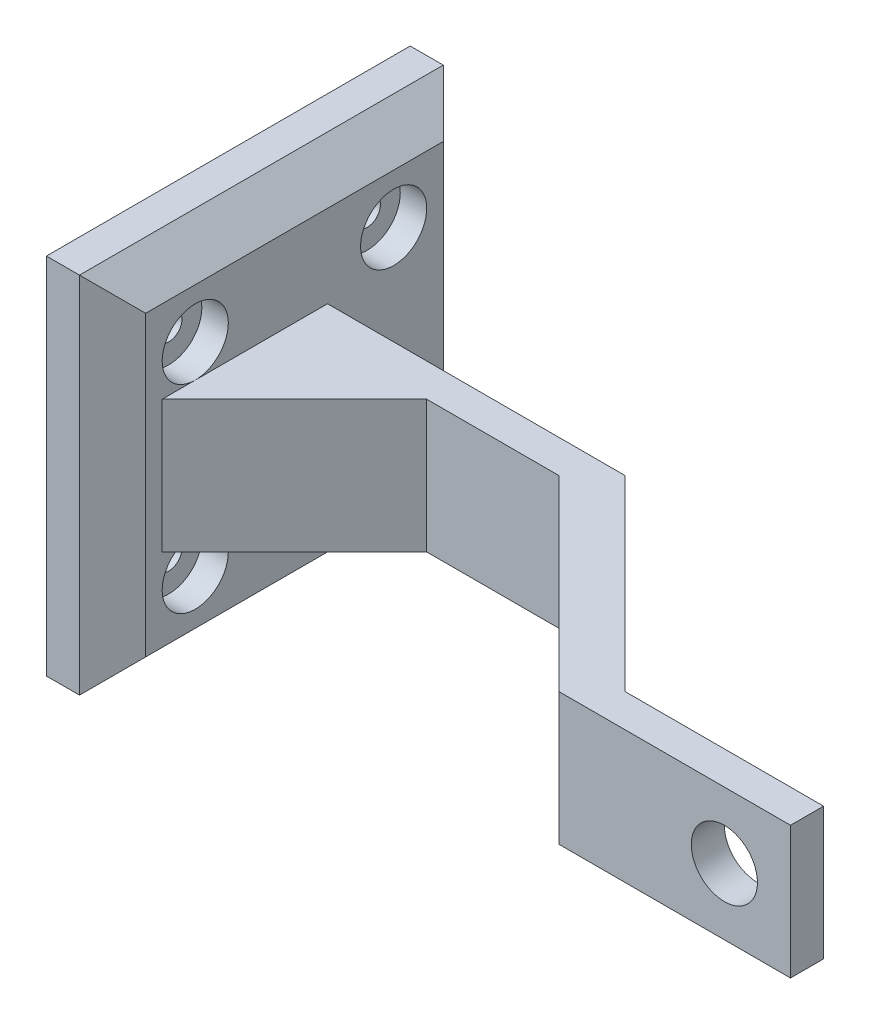
ISO-10303-21;
HEADER;
FILE_DESCRIPTION(('STEP AP214'),'2;1');
FILE_NAME('part.step','',(''),(''),'','','');
FILE_SCHEMA(('AUTOMOTIVE_DESIGN { 1 0 10303 214 1 1 1 1 }'));
ENDSEC;
DATA;
#1=APPLICATION_CONTEXT('core data for automotive mechanical design processes');
#2=APPLICATION_PROTOCOL_DEFINITION('international standard','automotive_design',2000,#1);
#3=PRODUCT_CONTEXT('',#1,'mechanical');
#4=PRODUCT('Part','Part','',(#3));
#5=PRODUCT_RELATED_PRODUCT_CATEGORY('part','',(#4));
#6=PRODUCT_DEFINITION_FORMATION('','',#4);
#7=PRODUCT_DEFINITION_CONTEXT('part definition',#1,'design');
#8=PRODUCT_DEFINITION('design','',#6,#7);
#9=PRODUCT_DEFINITION_SHAPE('','',#8);
#10=(LENGTH_UNIT() NAMED_UNIT(*) SI_UNIT(.MILLI.,.METRE.));
#11=(NAMED_UNIT(*) PLANE_ANGLE_UNIT() SI_UNIT($,.RADIAN.));
#12=(NAMED_UNIT(*) SI_UNIT($,.STERADIAN.) SOLID_ANGLE_UNIT());
#13=UNCERTAINTY_MEASURE_WITH_UNIT(LENGTH_MEASURE(1.E-05),#10,'distance_accuracy_value','');
#14=(GEOMETRIC_REPRESENTATION_CONTEXT(3) GLOBAL_UNCERTAINTY_ASSIGNED_CONTEXT((#13)) GLOBAL_UNIT_ASSIGNED_CONTEXT((#10,
#11,#12)) REPRESENTATION_CONTEXT('',''));
#15=CARTESIAN_POINT('',(0.,0.,0.));
#16=DIRECTION('',(0.,0.,1.));
#17=DIRECTION('',(1.,0.,0.));
#18=AXIS2_PLACEMENT_3D('',#15,#16,#17);
#19=CARTESIAN_POINT('',(-103.284271247462,15.,-38.2842712474619));
#20=DIRECTION('',(1.,0.,0.));
#21=DIRECTION('',(0.,0.,-1.));
#22=AXIS2_PLACEMENT_3D('',#19,#20,#21);
#23=CYLINDRICAL_SURFACE('',#22,2.);
#24=CARTESIAN_POINT('',(-103.284271247462,15.,-38.2842712474619));
#25=DIRECTION('',(1.,0.,0.));
#26=DIRECTION('',(0.,0.,-1.));
#27=AXIS2_PLACEMENT_3D('',#24,#25,#26);
#28=CIRCLE('',#27,2.);
#29=CARTESIAN_POINT('',(-103.284271247462,15.,-40.2842712474619));
#30=VERTEX_POINT('',#29);
#31=EDGE_CURVE('E272',#30,#30,#28,.T.);
#32=ORIENTED_EDGE('',*,*,#31,.F.);
#33=EDGE_LOOP('',(#32));
#34=FACE_BOUND('',#33,.T.);
#35=CARTESIAN_POINT('',(-97.2842712474619,15.,-38.2842712474619));
#36=DIRECTION('',(1.,0.,0.));
#37=DIRECTION('',(0.,0.,-1.));
#38=AXIS2_PLACEMENT_3D('',#35,#36,#37);
#39=CIRCLE('',#38,2.);
#40=CARTESIAN_POINT('',(-97.2842712474619,15.,-40.2842712474619));
#41=VERTEX_POINT('',#40);
#42=EDGE_CURVE('E330',#41,#41,#39,.T.);
#43=ORIENTED_EDGE('',*,*,#42,.T.);
#44=EDGE_LOOP('',(#43));
#45=FACE_BOUND('',#44,.T.);
#46=ADVANCED_FACE('F35',(#34,#45),#23,.F.);
#47=CARTESIAN_POINT('',(-103.284271247462,-15.,-8.28427124746191));
#48=DIRECTION('',(1.,0.,0.));
#49=DIRECTION('',(0.,0.,-1.));
#50=AXIS2_PLACEMENT_3D('',#47,#48,#49);
#51=CYLINDRICAL_SURFACE('',#50,2.);
#52=CARTESIAN_POINT('',(-103.284271247462,-15.,-8.28427124746191));
#53=DIRECTION('',(1.,0.,0.));
#54=DIRECTION('',(0.,0.,-1.));
#55=AXIS2_PLACEMENT_3D('',#52,#53,#54);
#56=CIRCLE('',#55,2.);
#57=CARTESIAN_POINT('',(-103.284271247462,-15.,-10.2842712474619));
#58=VERTEX_POINT('',#57);
#59=EDGE_CURVE('E313',#58,#58,#56,.T.);
#60=ORIENTED_EDGE('',*,*,#59,.F.);
#61=EDGE_LOOP('',(#60));
#62=FACE_BOUND('',#61,.T.);
#63=CARTESIAN_POINT('',(-97.2842712474619,-15.,-8.28427124746191));
#64=DIRECTION('',(1.,0.,0.));
#65=DIRECTION('',(0.,0.,-1.));
#66=AXIS2_PLACEMENT_3D('',#63,#64,#65);
#67=CIRCLE('',#66,2.);
#68=CARTESIAN_POINT('',(-97.2842712474619,-15.,-10.2842712474619));
#69=VERTEX_POINT('',#68);
#70=EDGE_CURVE('E342',#69,#69,#67,.T.);
#71=ORIENTED_EDGE('',*,*,#70,.T.);
#72=EDGE_LOOP('',(#71));
#73=FACE_BOUND('',#72,.T.);
#74=ADVANCED_FACE('F351',(#62,#73),#51,.F.);
#75=CARTESIAN_POINT('',(-103.284271247462,-15.,-38.2842712474619));
#76=DIRECTION('',(1.,0.,0.));
#77=DIRECTION('',(0.,0.,-1.));
#78=AXIS2_PLACEMENT_3D('',#75,#76,#77);
#79=CYLINDRICAL_SURFACE('',#78,2.);
#80=CARTESIAN_POINT('',(-103.284271247462,-15.,-38.2842712474619));
#81=DIRECTION('',(1.,0.,0.));
#82=DIRECTION('',(0.,0.,1.));
#83=AXIS2_PLACEMENT_3D('',#80,#81,#82);
#84=CIRCLE('',#83,2.);
#85=CARTESIAN_POINT('',(-103.284271247462,-15.,-36.2842712474619));
#86=VERTEX_POINT('',#85);
#87=EDGE_CURVE('E309',#86,#86,#84,.T.);
#88=ORIENTED_EDGE('',*,*,#87,.F.);
#89=EDGE_LOOP('',(#88));
#90=FACE_BOUND('',#89,.T.);
#91=CARTESIAN_POINT('',(-97.2842712474619,-15.,-38.2842712474619));
#92=DIRECTION('',(1.,0.,0.));
#93=DIRECTION('',(0.,0.,-1.));
#94=AXIS2_PLACEMENT_3D('',#91,#92,#93);
#95=CIRCLE('',#94,2.);
#96=CARTESIAN_POINT('',(-97.2842712474619,-15.,-40.2842712474619));
#97=VERTEX_POINT('',#96);
#98=EDGE_CURVE('E333',#97,#97,#95,.T.);
#99=ORIENTED_EDGE('',*,*,#98,.T.);
#100=EDGE_LOOP('',(#99));
#101=FACE_BOUND('',#100,.T.);
#102=ADVANCED_FACE('F377',(#90,#101),#79,.F.);
#103=CARTESIAN_POINT('',(-103.284271247462,15.,-8.28427124746191));
#104=DIRECTION('',(1.,0.,0.));
#105=DIRECTION('',(0.,0.,-1.));
#106=AXIS2_PLACEMENT_3D('',#103,#104,#105);
#107=CYLINDRICAL_SURFACE('',#106,2.);
#108=CARTESIAN_POINT('',(-103.284271247462,15.,-8.28427124746191));
#109=DIRECTION('',(1.,0.,0.));
#110=DIRECTION('',(0.,0.,1.));
#111=AXIS2_PLACEMENT_3D('',#108,#109,#110);
#112=CIRCLE('',#111,2.);
#113=CARTESIAN_POINT('',(-103.284271247462,15.,-6.28427124746191));
#114=VERTEX_POINT('',#113);
#115=EDGE_CURVE('E310',#114,#114,#112,.T.);
#116=ORIENTED_EDGE('',*,*,#115,.F.);
#117=EDGE_LOOP('',(#116));
#118=FACE_BOUND('',#117,.T.);
#119=CARTESIAN_POINT('',(-97.2842712474619,15.,-8.28427124746191));
#120=DIRECTION('',(1.,0.,0.));
#121=DIRECTION('',(0.,0.,-1.));
#122=AXIS2_PLACEMENT_3D('',#119,#120,#121);
#123=CIRCLE('',#122,2.);
#124=CARTESIAN_POINT('',(-97.2842712474619,15.,-10.2842712474619));
#125=VERTEX_POINT('',#124);
#126=EDGE_CURVE('E320',#125,#125,#123,.T.);
#127=ORIENTED_EDGE('',*,*,#126,.T.);
#128=EDGE_LOOP('',(#127));
#129=FACE_BOUND('',#128,.T.);
#130=ADVANCED_FACE('F384',(#118,#129),#107,.F.);
#131=CARTESIAN_POINT('',(0.,0.,0.));
#132=DIRECTION('',(0.,0.,-1.));
#133=DIRECTION('',(-1.,0.,0.));
#134=AXIS2_PLACEMENT_3D('',#131,#132,#133);
#135=PLANE('',#134);
#136=CARTESIAN_POINT('',(0.,0.,0.));
#137=DIRECTION('',(0.,0.,1.));
#138=DIRECTION('',(1.,0.,0.));
#139=AXIS2_PLACEMENT_3D('',#136,#137,#138);
#140=CIRCLE('',#139,5.);
#141=CARTESIAN_POINT('',(5.,0.,0.));
#142=VERTEX_POINT('',#141);
#143=EDGE_CURVE('E218',#142,#142,#140,.T.);
#144=ORIENTED_EDGE('',*,*,#143,.T.);
#145=EDGE_LOOP('',(#144));
#146=FACE_BOUND('',#145,.T.);
#147=DIRECTION('',(1.,0.,0.));
#148=VECTOR('',#147,1.);
#149=CARTESIAN_POINT('',(10.,-10.,0.));
#150=LINE('',#149,#148);
#151=CARTESIAN_POINT('',(-20.,-10.,0.));
#152=VERTEX_POINT('',#151);
#153=CARTESIAN_POINT('',(10.,-10.,0.));
#154=VERTEX_POINT('',#153);
#155=EDGE_CURVE('E222',#152,#154,#150,.T.);
#156=ORIENTED_EDGE('',*,*,#155,.F.);
#157=DIRECTION('',(0.,-1.,0.));
#158=VECTOR('',#157,1.);
#159=CARTESIAN_POINT('',(-20.,90.4886769971167,0.));
#160=LINE('',#159,#158);
#161=CARTESIAN_POINT('',(-20.,10.,0.));
#162=VERTEX_POINT('',#161);
#163=EDGE_CURVE('E206',#162,#152,#160,.T.);
#164=ORIENTED_EDGE('',*,*,#163,.F.);
#165=DIRECTION('',(-1.,0.,0.));
#166=VECTOR('',#165,1.);
#167=CARTESIAN_POINT('',(10.,10.,0.));
#168=LINE('',#167,#166);
#169=CARTESIAN_POINT('',(10.,10.,0.));
#170=VERTEX_POINT('',#169);
#171=EDGE_CURVE('E228',#170,#162,#168,.T.);
#172=ORIENTED_EDGE('',*,*,#171,.F.);
#173=DIRECTION('',(0.,1.,0.));
#174=VECTOR('',#173,1.);
#175=CARTESIAN_POINT('',(10.,10.,0.));
#176=LINE('',#175,#174);
#177=EDGE_CURVE('E234',#154,#170,#176,.T.);
#178=ORIENTED_EDGE('',*,*,#177,.F.);
#179=EDGE_LOOP('',(#156,#164,#172,#178));
#180=FACE_BOUND('',#179,.T.);
#181=ADVANCED_FACE('F425',(#146,#180),#135,.T.);
#182=CARTESIAN_POINT('',(0.,0.,5.));
#183=DIRECTION('',(0.,0.,-1.));
#184=DIRECTION('',(-1.,0.,0.));
#185=AXIS2_PLACEMENT_3D('',#182,#183,#184);
#186=PLANE('',#185);
#187=DIRECTION('',(-1.,0.,0.));
#188=VECTOR('',#187,1.);
#189=CARTESIAN_POINT('',(10.,10.,5.));
#190=LINE('',#189,#188);
#191=CARTESIAN_POINT('',(10.,10.,5.));
#192=VERTEX_POINT('',#191);
#193=CARTESIAN_POINT('',(-25.,10.,5.));
#194=VERTEX_POINT('',#193);
#195=EDGE_CURVE('E230',#192,#194,#190,.T.);
#196=ORIENTED_EDGE('',*,*,#195,.T.);
#197=DIRECTION('',(0.,1.,0.));
#198=VECTOR('',#197,1.);
#199=CARTESIAN_POINT('',(-25.,-10.,5.));
#200=LINE('',#199,#198);
#201=CARTESIAN_POINT('',(-25.,-10.,5.));
#202=VERTEX_POINT('',#201);
#203=EDGE_CURVE('E215',#202,#194,#200,.T.);
#204=ORIENTED_EDGE('',*,*,#203,.F.);
#205=DIRECTION('',(1.,0.,0.));
#206=VECTOR('',#205,1.);
#207=CARTESIAN_POINT('',(10.,-10.,5.));
#208=LINE('',#207,#206);
#209=CARTESIAN_POINT('',(10.,-10.,5.));
#210=VERTEX_POINT('',#209);
#211=EDGE_CURVE('E225',#202,#210,#208,.T.);
#212=ORIENTED_EDGE('',*,*,#211,.T.);
#213=DIRECTION('',(0.,1.,0.));
#214=VECTOR('',#213,1.);
#215=CARTESIAN_POINT('',(10.,10.,5.));
#216=LINE('',#215,#214);
#217=EDGE_CURVE('E227',#210,#192,#216,.T.);
#218=ORIENTED_EDGE('',*,*,#217,.T.);
#219=EDGE_LOOP('',(#196,#204,#212,#218));
#220=FACE_BOUND('',#219,.T.);
#221=CARTESIAN_POINT('',(0.,0.,5.));
#222=DIRECTION('',(0.,0.,1.));
#223=DIRECTION('',(1.,0.,0.));
#224=AXIS2_PLACEMENT_3D('',#221,#222,#223);
#225=CIRCLE('',#224,5.);
#226=CARTESIAN_POINT('',(5.,0.,5.));
#227=VERTEX_POINT('',#226);
#228=EDGE_CURVE('E219',#227,#227,#225,.T.);
#229=ORIENTED_EDGE('',*,*,#228,.F.);
#230=EDGE_LOOP('',(#229));
#231=FACE_BOUND('',#230,.T.);
#232=ADVANCED_FACE('F421',(#220,#231),#186,.F.);
#233=CARTESIAN_POINT('',(10.,-10.,5.));
#234=DIRECTION('',(0.,1.,0.));
#235=DIRECTION('',(-1.,0.,0.));
#236=AXIS2_PLACEMENT_3D('',#233,#234,#235);
#237=PLANE('',#236);
#238=DIRECTION('',(-0.707106781186547,0.,-0.707106781186548));
#239=VECTOR('',#238,1.);
#240=CARTESIAN_POINT('',(-10.,-10.,10.));
#241=LINE('',#240,#239);
#242=CARTESIAN_POINT('',(-48.2842712474619,-10.,-28.2842712474619));
#243=VERTEX_POINT('',#242);
#244=EDGE_CURVE('E202',#152,#243,#241,.T.);
#245=ORIENTED_EDGE('',*,*,#244,.F.);
#246=ORIENTED_EDGE('',*,*,#155,.T.);
#247=DIRECTION('',(0.,0.,-1.));
#248=VECTOR('',#247,1.);
#249=CARTESIAN_POINT('',(10.,-10.,5.));
#250=LINE('',#249,#248);
#251=EDGE_CURVE('E240',#210,#154,#250,.T.);
#252=ORIENTED_EDGE('',*,*,#251,.F.);
#253=ORIENTED_EDGE('',*,*,#211,.F.);
#254=DIRECTION('',(-0.707106781186547,0.,-0.707106781186548));
#255=VECTOR('',#254,1.);
#256=CARTESIAN_POINT('',(-15.,-10.,15.));
#257=LINE('',#256,#255);
#258=CARTESIAN_POINT('',(-53.2842712474619,-10.,-23.2842712474619));
#259=VERTEX_POINT('',#258);
#260=EDGE_CURVE('E170',#202,#259,#257,.T.);
#261=ORIENTED_EDGE('',*,*,#260,.T.);
#262=DIRECTION('',(-1.,0.,0.));
#263=VECTOR('',#262,1.);
#264=CARTESIAN_POINT('',(0.,-10.,-23.2842712474619));
#265=LINE('',#264,#263);
#266=CARTESIAN_POINT('',(-73.2842712474618,-10.,-23.2842712474619));
#267=VERTEX_POINT('',#266);
#268=EDGE_CURVE('E173',#259,#267,#265,.T.);
#269=ORIENTED_EDGE('',*,*,#268,.T.);
#270=DIRECTION('',(-0.707106781186551,0.,0.707106781186544));
#271=VECTOR('',#270,1.);
#272=CARTESIAN_POINT('',(-45.7842712474615,-10.,-50.784271247462));
#273=LINE('',#272,#271);
#274=CARTESIAN_POINT('',(-93.2842712474619,-10.,-3.28427124746195));
#275=VERTEX_POINT('',#274);
#276=EDGE_CURVE('E249',#267,#275,#273,.T.);
#277=ORIENTED_EDGE('',*,*,#276,.T.);
#278=DIRECTION('',(0.,0.,1.));
#279=VECTOR('',#278,1.);
#280=CARTESIAN_POINT('',(-93.2842712474619,-10.,0.));
#281=LINE('',#280,#279);
#282=CARTESIAN_POINT('',(-93.2842712474619,-10.,-8.28427124746191));
#283=VERTEX_POINT('',#282);
#284=EDGE_CURVE('E195',#283,#275,#281,.T.);
#285=ORIENTED_EDGE('',*,*,#284,.F.);
#286=CARTESIAN_POINT('',(-93.2842712474619,-10.,-28.2842712474619));
#287=VERTEX_POINT('',#286);
#288=EDGE_CURVE('E196',#287,#283,#281,.T.);
#289=ORIENTED_EDGE('',*,*,#288,.F.);
#290=DIRECTION('',(-1.,0.,0.));
#291=VECTOR('',#290,1.);
#292=CARTESIAN_POINT('',(0.,-10.,-28.2842712474619));
#293=LINE('',#292,#291);
#294=EDGE_CURVE('E199',#243,#287,#293,.T.);
#295=ORIENTED_EDGE('',*,*,#294,.F.);
#296=EDGE_LOOP('',(#245,#246,#252,#253,#261,#269,#277,#285,#289,#295));
#297=FACE_BOUND('',#296,.T.);
#298=ADVANCED_FACE('F424',(#297),#237,.F.);
#299=CARTESIAN_POINT('',(10.,10.,5.));
#300=DIRECTION('',(-1.,0.,0.));
#301=DIRECTION('',(0.,-1.,0.));
#302=AXIS2_PLACEMENT_3D('',#299,#300,#301);
#303=PLANE('',#302);
#304=ORIENTED_EDGE('',*,*,#177,.T.);
#305=DIRECTION('',(0.,0.,-1.));
#306=VECTOR('',#305,1.);
#307=CARTESIAN_POINT('',(10.,10.,5.));
#308=LINE('',#307,#306);
#309=EDGE_CURVE('E232',#192,#170,#308,.T.);
#310=ORIENTED_EDGE('',*,*,#309,.F.);
#311=ORIENTED_EDGE('',*,*,#217,.F.);
#312=ORIENTED_EDGE('',*,*,#251,.T.);
#313=EDGE_LOOP('',(#304,#310,#311,#312));
#314=FACE_BOUND('',#313,.T.);
#315=ADVANCED_FACE('F432',(#314),#303,.F.);
#316=CARTESIAN_POINT('',(10.,10.,5.));
#317=DIRECTION('',(0.,-1.,0.));
#318=DIRECTION('',(0.,0.,-1.));
#319=AXIS2_PLACEMENT_3D('',#316,#317,#318);
#320=PLANE('',#319);
#321=ORIENTED_EDGE('',*,*,#171,.T.);
#322=DIRECTION('',(0.707106781186547,0.,0.707106781186548));
#323=VECTOR('',#322,1.);
#324=CARTESIAN_POINT('',(-10.,10.,9.99999999999999));
#325=LINE('',#324,#323);
#326=CARTESIAN_POINT('',(-48.2842712474619,9.99999999999999,-28.2842712474619));
#327=VERTEX_POINT('',#326);
#328=EDGE_CURVE('E186',#327,#162,#325,.T.);
#329=ORIENTED_EDGE('',*,*,#328,.F.);
#330=DIRECTION('',(1.,0.,0.));
#331=VECTOR('',#330,1.);
#332=CARTESIAN_POINT('',(0.,9.99999999999999,-28.2842712474619));
#333=LINE('',#332,#331);
#334=CARTESIAN_POINT('',(-93.2842712474619,10.,-28.2842712474619));
#335=VERTEX_POINT('',#334);
#336=EDGE_CURVE('E182',#335,#327,#333,.T.);
#337=ORIENTED_EDGE('',*,*,#336,.F.);
#338=DIRECTION('',(0.,0.,-1.));
#339=VECTOR('',#338,1.);
#340=CARTESIAN_POINT('',(-93.2842712474619,10.,0.));
#341=LINE('',#340,#339);
#342=CARTESIAN_POINT('',(-93.2842712474619,10.,-8.28427124746191));
#343=VERTEX_POINT('',#342);
#344=EDGE_CURVE('E183',#343,#335,#341,.T.);
#345=ORIENTED_EDGE('',*,*,#344,.F.);
#346=CARTESIAN_POINT('',(-93.2842712474619,10.,-3.28427124746195));
#347=VERTEX_POINT('',#346);
#348=EDGE_CURVE('E179',#347,#343,#341,.T.);
#349=ORIENTED_EDGE('',*,*,#348,.F.);
#350=DIRECTION('',(0.707106781186551,0.,-0.707106781186544));
#351=VECTOR('',#350,1.);
#352=CARTESIAN_POINT('',(-45.7842712474615,10.,-50.784271247462));
#353=LINE('',#352,#351);
#354=CARTESIAN_POINT('',(-73.2842712474618,9.99999999999999,-23.2842712474619));
#355=VERTEX_POINT('',#354);
#356=EDGE_CURVE('E252',#347,#355,#353,.T.);
#357=ORIENTED_EDGE('',*,*,#356,.T.);
#358=DIRECTION('',(1.,0.,0.));
#359=VECTOR('',#358,1.);
#360=CARTESIAN_POINT('',(0.,9.99999999999999,-23.2842712474619));
#361=LINE('',#360,#359);
#362=CARTESIAN_POINT('',(-53.2842712474619,9.99999999999999,-23.2842712474619));
#363=VERTEX_POINT('',#362);
#364=EDGE_CURVE('E191',#355,#363,#361,.T.);
#365=ORIENTED_EDGE('',*,*,#364,.T.);
#366=DIRECTION('',(0.707106781186547,0.,0.707106781186548));
#367=VECTOR('',#366,1.);
#368=CARTESIAN_POINT('',(-15.,10.,15.));
#369=LINE('',#368,#367);
#370=EDGE_CURVE('E189',#363,#194,#369,.T.);
#371=ORIENTED_EDGE('',*,*,#370,.T.);
#372=ORIENTED_EDGE('',*,*,#195,.F.);
#373=ORIENTED_EDGE('',*,*,#309,.T.);
#374=EDGE_LOOP('',(#321,#329,#337,#345,#349,#357,#365,#371,#372,#373));
#375=FACE_BOUND('',#374,.T.);
#376=ADVANCED_FACE('F419',(#375),#320,.F.);
#377=CARTESIAN_POINT('',(0.,0.,5.));
#378=DIRECTION('',(0.,0.,-1.));
#379=DIRECTION('',(-1.,0.,0.));
#380=AXIS2_PLACEMENT_3D('',#377,#378,#379);
#381=CYLINDRICAL_SURFACE('',#380,5.);
#382=ORIENTED_EDGE('',*,*,#228,.T.);
#383=EDGE_LOOP('',(#382));
#384=FACE_BOUND('',#383,.T.);
#385=ORIENTED_EDGE('',*,*,#143,.F.);
#386=EDGE_LOOP('',(#385));
#387=FACE_BOUND('',#386,.T.);
#388=ADVANCED_FACE('F415',(#384,#387),#381,.F.);
#389=CARTESIAN_POINT('',(-15.,90.4886769971167,15.));
#390=DIRECTION('',(-0.707106781186548,0.,0.707106781186547));
#391=DIRECTION('',(0.707106781186547,0.,0.707106781186548));
#392=AXIS2_PLACEMENT_3D('',#389,#390,#391);
#393=PLANE('',#392);
#394=ORIENTED_EDGE('',*,*,#370,.F.);
#395=DIRECTION('',(0.,-1.,0.));
#396=VECTOR('',#395,1.);
#397=CARTESIAN_POINT('',(-53.2842712474619,90.4886769971167,-23.2842712474619));
#398=LINE('',#397,#396);
#399=EDGE_CURVE('E205',#363,#259,#398,.T.);
#400=ORIENTED_EDGE('',*,*,#399,.T.);
#401=ORIENTED_EDGE('',*,*,#260,.F.);
#402=ORIENTED_EDGE('',*,*,#203,.T.);
#403=EDGE_LOOP('',(#394,#400,#401,#402));
#404=FACE_BOUND('',#403,.T.);
#405=ADVANCED_FACE('F405',(#404),#393,.T.);
#406=CARTESIAN_POINT('',(-10.,90.4886769971167,10.));
#407=DIRECTION('',(-0.707106781186548,0.,0.707106781186547));
#408=DIRECTION('',(0.707106781186547,0.,0.707106781186548));
#409=AXIS2_PLACEMENT_3D('',#406,#407,#408);
#410=PLANE('',#409);
#411=DIRECTION('',(0.,-1.,0.));
#412=VECTOR('',#411,1.);
#413=CARTESIAN_POINT('',(-48.2842712474619,90.4886769971167,-28.2842712474619));
#414=LINE('',#413,#412);
#415=EDGE_CURVE('E209',#327,#243,#414,.T.);
#416=ORIENTED_EDGE('',*,*,#415,.F.);
#417=ORIENTED_EDGE('',*,*,#328,.T.);
#418=ORIENTED_EDGE('',*,*,#163,.T.);
#419=ORIENTED_EDGE('',*,*,#244,.T.);
#420=EDGE_LOOP('',(#416,#417,#418,#419));
#421=FACE_BOUND('',#420,.T.);
#422=ADVANCED_FACE('F401',(#421),#410,.F.);
#423=CARTESIAN_POINT('',(0.,90.4886769971168,-28.2842712474619));
#424=DIRECTION('',(0.,0.,1.));
#425=DIRECTION('',(1.,0.,0.));
#426=AXIS2_PLACEMENT_3D('',#423,#424,#425);
#427=PLANE('',#426);
#428=DIRECTION('',(0.,-1.,0.));
#429=VECTOR('',#428,1.);
#430=CARTESIAN_POINT('',(-93.2842712474619,90.4886769971167,-28.2842712474619));
#431=LINE('',#430,#429);
#432=EDGE_CURVE('E211',#335,#287,#431,.T.);
#433=ORIENTED_EDGE('',*,*,#432,.F.);
#434=ORIENTED_EDGE('',*,*,#336,.T.);
#435=ORIENTED_EDGE('',*,*,#415,.T.);
#436=ORIENTED_EDGE('',*,*,#294,.T.);
#437=EDGE_LOOP('',(#433,#434,#435,#436));
#438=FACE_BOUND('',#437,.T.);
#439=ADVANCED_FACE('F404',(#438),#427,.F.);
#440=CARTESIAN_POINT('',(0.,90.4886769971168,-23.2842712474619));
#441=DIRECTION('',(0.,0.,1.));
#442=DIRECTION('',(1.,0.,0.));
#443=AXIS2_PLACEMENT_3D('',#440,#441,#442);
#444=PLANE('',#443);
#445=ORIENTED_EDGE('',*,*,#364,.F.);
#446=DIRECTION('',(0.,-1.,0.));
#447=VECTOR('',#446,1.);
#448=CARTESIAN_POINT('',(-73.2842712474618,90.4886769971168,-23.2842712474619));
#449=LINE('',#448,#447);
#450=EDGE_CURVE('E243',#355,#267,#449,.T.);
#451=ORIENTED_EDGE('',*,*,#450,.T.);
#452=ORIENTED_EDGE('',*,*,#268,.F.);
#453=ORIENTED_EDGE('',*,*,#399,.F.);
#454=EDGE_LOOP('',(#445,#451,#452,#453));
#455=FACE_BOUND('',#454,.T.);
#456=ADVANCED_FACE('F391',(#455),#444,.T.);
#457=CARTESIAN_POINT('',(-93.2842712474619,0.,0.));
#458=DIRECTION('',(-1.,0.,0.));
#459=DIRECTION('',(0.,0.,1.));
#460=AXIS2_PLACEMENT_3D('',#457,#458,#459);
#461=PLANE('',#460);
#462=CARTESIAN_POINT('',(-93.2842712474619,-15.,-38.2842712474619));
#463=DIRECTION('',(1.,0.,0.));
#464=DIRECTION('',(0.,0.,-1.));
#465=AXIS2_PLACEMENT_3D('',#462,#463,#464);
#466=CIRCLE('',#465,5.);
#467=CARTESIAN_POINT('',(-93.2842712474619,-15.,-43.2842712474619));
#468=VERTEX_POINT('',#467);
#469=EDGE_CURVE('E336',#468,#468,#466,.T.);
#470=ORIENTED_EDGE('',*,*,#469,.F.);
#471=EDGE_LOOP('',(#470));
#472=FACE_BOUND('',#471,.T.);
#473=CARTESIAN_POINT('',(-93.2842712474619,15.,-38.2842712474619));
#474=DIRECTION('',(1.,0.,0.));
#475=DIRECTION('',(0.,0.,-1.));
#476=AXIS2_PLACEMENT_3D('',#473,#474,#475);
#477=CIRCLE('',#476,5.);
#478=CARTESIAN_POINT('',(-93.2842712474619,15.,-43.2842712474619));
#479=VERTEX_POINT('',#478);
#480=EDGE_CURVE('E326',#479,#479,#477,.T.);
#481=ORIENTED_EDGE('',*,*,#480,.F.);
#482=EDGE_LOOP('',(#481));
#483=FACE_BOUND('',#482,.T.);
#484=DIRECTION('',(0.,0.,1.));
#485=VECTOR('',#484,1.);
#486=CARTESIAN_POINT('',(-93.2842712474619,22.5,0.));
#487=LINE('',#486,#485);
#488=CARTESIAN_POINT('',(-93.2842712474619,22.5,-45.7842712474619));
#489=VERTEX_POINT('',#488);
#490=CARTESIAN_POINT('',(-93.2842712474619,22.5,-0.78427124746193));
#491=VERTEX_POINT('',#490);
#492=EDGE_CURVE('E261',#489,#491,#487,.T.);
#493=ORIENTED_EDGE('',*,*,#492,.T.);
#494=DIRECTION('',(0.,-1.,0.));
#495=VECTOR('',#494,1.);
#496=CARTESIAN_POINT('',(-93.2842712474619,0.,-0.78427124746193));
#497=LINE('',#496,#495);
#498=CARTESIAN_POINT('',(-93.2842712474619,-22.5,-0.78427124746193));
#499=VERTEX_POINT('',#498);
#500=EDGE_CURVE('E263',#491,#499,#497,.T.);
#501=ORIENTED_EDGE('',*,*,#500,.T.);
#502=DIRECTION('',(0.,0.,-1.));
#503=VECTOR('',#502,1.);
#504=CARTESIAN_POINT('',(-93.2842712474619,-22.5,0.));
#505=LINE('',#504,#503);
#506=CARTESIAN_POINT('',(-93.2842712474619,-22.5,-45.7842712474619));
#507=VERTEX_POINT('',#506);
#508=EDGE_CURVE('E257',#499,#507,#505,.T.);
#509=ORIENTED_EDGE('',*,*,#508,.T.);
#510=DIRECTION('',(0.,1.,0.));
#511=VECTOR('',#510,1.);
#512=CARTESIAN_POINT('',(-93.2842712474619,0.,-45.7842712474619));
#513=LINE('',#512,#511);
#514=EDGE_CURVE('E259',#507,#489,#513,.T.);
#515=ORIENTED_EDGE('',*,*,#514,.T.);
#516=EDGE_LOOP('',(#493,#501,#509,#515));
#517=FACE_BOUND('',#516,.T.);
#518=ORIENTED_EDGE('',*,*,#288,.T.);
#519=CARTESIAN_POINT('',(-93.2842712474619,-15.,-8.28427124746191));
#520=DIRECTION('',(1.,0.,0.));
#521=DIRECTION('',(0.,0.,-1.));
#522=AXIS2_PLACEMENT_3D('',#519,#520,#521);
#523=CIRCLE('',#522,5.);
#524=EDGE_CURVE('E50',#283,#283,#523,.T.);
#525=ORIENTED_EDGE('',*,*,#524,.F.);
#526=ORIENTED_EDGE('',*,*,#284,.T.);
#527=DIRECTION('',(0.,1.,0.));
#528=VECTOR('',#527,1.);
#529=CARTESIAN_POINT('',(-93.2842712474619,0.,-3.28427124746195));
#530=LINE('',#529,#528);
#531=EDGE_CURVE('E246',#275,#347,#530,.T.);
#532=ORIENTED_EDGE('',*,*,#531,.T.);
#533=ORIENTED_EDGE('',*,*,#348,.T.);
#534=CARTESIAN_POINT('',(-93.2842712474619,15.,-8.28427124746191));
#535=DIRECTION('',(1.,0.,0.));
#536=DIRECTION('',(0.,0.,-1.));
#537=AXIS2_PLACEMENT_3D('',#534,#535,#536);
#538=CIRCLE('',#537,5.);
#539=EDGE_CURVE('E55',#343,#343,#538,.T.);
#540=ORIENTED_EDGE('',*,*,#539,.F.);
#541=ORIENTED_EDGE('',*,*,#344,.T.);
#542=ORIENTED_EDGE('',*,*,#432,.T.);
#543=EDGE_LOOP('',(#518,#525,#526,#532,#533,#540,#541,#542));
#544=FACE_BOUND('',#543,.T.);
#545=ADVANCED_FACE('F288',(#472,#483,#517,#544),#461,.F.);
#546=CARTESIAN_POINT('',(-103.284271247462,-27.5,-50.7842712474619));
#547=DIRECTION('',(0.,0.,1.));
#548=DIRECTION('',(1.,0.,0.));
#549=AXIS2_PLACEMENT_3D('',#546,#547,#548);
#550=PLANE('',#549);
#551=DIRECTION('',(1.,0.,0.));
#552=VECTOR('',#551,1.);
#553=CARTESIAN_POINT('',(-103.284271247462,27.5,-50.7842712474619));
#554=LINE('',#553,#552);
#555=CARTESIAN_POINT('',(-103.284271247462,27.5,-50.7842712474619));
#556=VERTEX_POINT('',#555);
#557=CARTESIAN_POINT('',(-98.2842712474619,27.5,-50.7842712474619));
#558=VERTEX_POINT('',#557);
#559=EDGE_CURVE('E302',#556,#558,#554,.T.);
#560=ORIENTED_EDGE('',*,*,#559,.T.);
#561=DIRECTION('',(0.,-1.,0.));
#562=VECTOR('',#561,1.);
#563=CARTESIAN_POINT('',(-98.2842712474619,-27.5,-50.7842712474619));
#564=LINE('',#563,#562);
#565=CARTESIAN_POINT('',(-98.2842712474619,-27.5,-50.7842712474619));
#566=VERTEX_POINT('',#565);
#567=EDGE_CURVE('E44',#558,#566,#564,.T.);
#568=ORIENTED_EDGE('',*,*,#567,.T.);
#569=DIRECTION('',(1.,0.,0.));
#570=VECTOR('',#569,1.);
#571=CARTESIAN_POINT('',(-103.284271247462,-27.5,-50.7842712474619));
#572=LINE('',#571,#570);
#573=CARTESIAN_POINT('',(-103.284271247462,-27.5,-50.7842712474619));
#574=VERTEX_POINT('',#573);
#575=EDGE_CURVE('E151',#574,#566,#572,.T.);
#576=ORIENTED_EDGE('',*,*,#575,.F.);
#577=DIRECTION('',(0.,-1.,0.));
#578=VECTOR('',#577,1.);
#579=CARTESIAN_POINT('',(-103.284271247462,-27.5,-50.7842712474619));
#580=LINE('',#579,#578);
#581=EDGE_CURVE('E158',#556,#574,#580,.T.);
#582=ORIENTED_EDGE('',*,*,#581,.F.);
#583=EDGE_LOOP('',(#560,#568,#576,#582));
#584=FACE_BOUND('',#583,.T.);
#585=ADVANCED_FACE('F168',(#584),#550,.F.);
#586=CARTESIAN_POINT('',(-103.284271247462,-27.5,4.21572875253809));
#587=DIRECTION('',(0.,1.,0.));
#588=DIRECTION('',(-1.,0.,0.));
#589=AXIS2_PLACEMENT_3D('',#586,#587,#588);
#590=PLANE('',#589);
#591=ORIENTED_EDGE('',*,*,#575,.T.);
#592=DIRECTION('',(0.,0.,1.));
#593=VECTOR('',#592,1.);
#594=CARTESIAN_POINT('',(-98.2842712474619,-27.5,4.21572875253809));
#595=LINE('',#594,#593);
#596=CARTESIAN_POINT('',(-98.2842712474619,-27.5,4.21572875253809));
#597=VERTEX_POINT('',#596);
#598=EDGE_CURVE('E11',#566,#597,#595,.T.);
#599=ORIENTED_EDGE('',*,*,#598,.T.);
#600=DIRECTION('',(1.,0.,0.));
#601=VECTOR('',#600,1.);
#602=CARTESIAN_POINT('',(-103.284271247462,-27.5,4.21572875253809));
#603=LINE('',#602,#601);
#604=CARTESIAN_POINT('',(-103.284271247462,-27.5,4.21572875253809));
#605=VERTEX_POINT('',#604);
#606=EDGE_CURVE('E154',#605,#597,#603,.T.);
#607=ORIENTED_EDGE('',*,*,#606,.F.);
#608=DIRECTION('',(0.,0.,1.));
#609=VECTOR('',#608,1.);
#610=CARTESIAN_POINT('',(-103.284271247462,-27.5,4.21572875253809));
#611=LINE('',#610,#609);
#612=EDGE_CURVE('E147',#574,#605,#611,.T.);
#613=ORIENTED_EDGE('',*,*,#612,.F.);
#614=EDGE_LOOP('',(#591,#599,#607,#613));
#615=FACE_BOUND('',#614,.T.);
#616=ADVANCED_FACE('F149',(#615),#590,.F.);
#617=CARTESIAN_POINT('',(-103.284271247462,-27.5,4.21572875253809));
#618=DIRECTION('',(0.,0.,-1.));
#619=DIRECTION('',(-1.,0.,0.));
#620=AXIS2_PLACEMENT_3D('',#617,#618,#619);
#621=PLANE('',#620);
#622=ORIENTED_EDGE('',*,*,#606,.T.);
#623=DIRECTION('',(0.,1.,0.));
#624=VECTOR('',#623,1.);
#625=CARTESIAN_POINT('',(-98.2842712474619,-27.5,4.21572875253809));
#626=LINE('',#625,#624);
#627=CARTESIAN_POINT('',(-98.2842712474619,27.5,4.21572875253809));
#628=VERTEX_POINT('',#627);
#629=EDGE_CURVE('E254',#597,#628,#626,.T.);
#630=ORIENTED_EDGE('',*,*,#629,.T.);
#631=DIRECTION('',(1.,0.,0.));
#632=VECTOR('',#631,1.);
#633=CARTESIAN_POINT('',(-103.284271247462,27.5,4.21572875253809));
#634=LINE('',#633,#632);
#635=CARTESIAN_POINT('',(-103.284271247462,27.5,4.21572875253809));
#636=VERTEX_POINT('',#635);
#637=EDGE_CURVE('E175',#636,#628,#634,.T.);
#638=ORIENTED_EDGE('',*,*,#637,.F.);
#639=DIRECTION('',(0.,1.,0.));
#640=VECTOR('',#639,1.);
#641=CARTESIAN_POINT('',(-103.284271247462,-27.5,4.21572875253809));
#642=LINE('',#641,#640);
#643=EDGE_CURVE('E157',#605,#636,#642,.T.);
#644=ORIENTED_EDGE('',*,*,#643,.F.);
#645=EDGE_LOOP('',(#622,#630,#638,#644));
#646=FACE_BOUND('',#645,.T.);
#647=ADVANCED_FACE('F300',(#646),#621,.F.);
#648=CARTESIAN_POINT('',(-103.284271247462,27.5,4.21572875253809));
#649=DIRECTION('',(0.,-1.,0.));
#650=DIRECTION('',(1.,0.,0.));
#651=AXIS2_PLACEMENT_3D('',#648,#649,#650);
#652=PLANE('',#651);
#653=ORIENTED_EDGE('',*,*,#637,.T.);
#654=DIRECTION('',(0.,0.,-1.));
#655=VECTOR('',#654,1.);
#656=CARTESIAN_POINT('',(-98.2842712474619,27.5,4.21572875253809));
#657=LINE('',#656,#655);
#658=EDGE_CURVE('E266',#628,#558,#657,.T.);
#659=ORIENTED_EDGE('',*,*,#658,.T.);
#660=ORIENTED_EDGE('',*,*,#559,.F.);
#661=DIRECTION('',(0.,0.,-1.));
#662=VECTOR('',#661,1.);
#663=CARTESIAN_POINT('',(-103.284271247462,27.5,4.21572875253809));
#664=LINE('',#663,#662);
#665=EDGE_CURVE('E163',#636,#556,#664,.T.);
#666=ORIENTED_EDGE('',*,*,#665,.F.);
#667=EDGE_LOOP('',(#653,#659,#660,#666));
#668=FACE_BOUND('',#667,.T.);
#669=ADVANCED_FACE('F301',(#668),#652,.F.);
#670=CARTESIAN_POINT('',(-103.284271247462,0.,0.));
#671=DIRECTION('',(-1.,0.,0.));
#672=DIRECTION('',(0.,0.,1.));
#673=AXIS2_PLACEMENT_3D('',#670,#671,#672);
#674=PLANE('',#673);
#675=ORIENTED_EDGE('',*,*,#87,.T.);
#676=EDGE_LOOP('',(#675));
#677=FACE_BOUND('',#676,.T.);
#678=ORIENTED_EDGE('',*,*,#59,.T.);
#679=EDGE_LOOP('',(#678));
#680=FACE_BOUND('',#679,.T.);
#681=ORIENTED_EDGE('',*,*,#115,.T.);
#682=EDGE_LOOP('',(#681));
#683=FACE_BOUND('',#682,.T.);
#684=ORIENTED_EDGE('',*,*,#31,.T.);
#685=EDGE_LOOP('',(#684));
#686=FACE_BOUND('',#685,.T.);
#687=ORIENTED_EDGE('',*,*,#581,.T.);
#688=ORIENTED_EDGE('',*,*,#612,.T.);
#689=ORIENTED_EDGE('',*,*,#643,.T.);
#690=ORIENTED_EDGE('',*,*,#665,.T.);
#691=EDGE_LOOP('',(#687,#688,#689,#690));
#692=FACE_BOUND('',#691,.T.);
#693=ADVANCED_FACE('F161',(#677,#680,#683,#686,#692),#674,.T.);
#694=CARTESIAN_POINT('',(-73.2842712474618,90.4886769971168,-23.2842712474619));
#695=DIRECTION('',(-0.707106781186544,0.,-0.707106781186551));
#696=DIRECTION('',(0.,-1.,0.));
#697=AXIS2_PLACEMENT_3D('',#694,#695,#696);
#698=PLANE('',#697);
#699=ORIENTED_EDGE('',*,*,#356,.F.);
#700=ORIENTED_EDGE('',*,*,#531,.F.);
#701=ORIENTED_EDGE('',*,*,#276,.F.);
#702=ORIENTED_EDGE('',*,*,#450,.F.);
#703=EDGE_LOOP('',(#699,#700,#701,#702));
#704=FACE_BOUND('',#703,.T.);
#705=ADVANCED_FACE('F387',(#704),#698,.F.);
#706=CARTESIAN_POINT('',(-98.2842712474619,-27.5,-50.7842712474619));
#707=DIRECTION('',(-0.707106781186549,0.,0.707106781186545));
#708=DIRECTION('',(0.,-1.,0.));
#709=AXIS2_PLACEMENT_3D('',#706,#707,#708);
#710=PLANE('',#709);
#711=DIRECTION('',(0.577350269189624,-0.577350269189627,0.577350269189627));
#712=VECTOR('',#711,1.);
#713=CARTESIAN_POINT('',(-79.9509379141286,9.16666666666658,-32.4509379141285));
#714=LINE('',#713,#712);
#715=EDGE_CURVE('E273',#489,#558,#714,.F.);
#716=ORIENTED_EDGE('',*,*,#715,.F.);
#717=ORIENTED_EDGE('',*,*,#514,.F.);
#718=DIRECTION('',(0.577350269189624,0.577350269189627,0.577350269189627));
#719=VECTOR('',#718,1.);
#720=CARTESIAN_POINT('',(-79.9509379141286,-9.16666666666662,-32.4509379141285));
#721=LINE('',#720,#719);
#722=EDGE_CURVE('E39',#566,#507,#721,.T.);
#723=ORIENTED_EDGE('',*,*,#722,.F.);
#724=ORIENTED_EDGE('',*,*,#567,.F.);
#725=EDGE_LOOP('',(#716,#717,#723,#724));
#726=FACE_BOUND('',#725,.T.);
#727=ADVANCED_FACE('F37',(#726),#710,.F.);
#728=CARTESIAN_POINT('',(-98.2842712474619,-27.5,4.21572875253809));
#729=DIRECTION('',(-0.70710678118655,0.707106781186545,0.));
#730=DIRECTION('',(0.,0.,1.));
#731=AXIS2_PLACEMENT_3D('',#728,#729,#730);
#732=PLANE('',#731);
#733=ORIENTED_EDGE('',*,*,#722,.T.);
#734=ORIENTED_EDGE('',*,*,#508,.F.);
#735=DIRECTION('',(-0.577350269189624,-0.577350269189627,0.577350269189627));
#736=VECTOR('',#735,1.);
#737=CARTESIAN_POINT('',(-98.2842712474619,-27.5,4.21572875253809));
#738=LINE('',#737,#736);
#739=EDGE_CURVE('E271',#597,#499,#738,.F.);
#740=ORIENTED_EDGE('',*,*,#739,.F.);
#741=ORIENTED_EDGE('',*,*,#598,.F.);
#742=EDGE_LOOP('',(#733,#734,#740,#741));
#743=FACE_BOUND('',#742,.T.);
#744=ADVANCED_FACE('F283',(#743),#732,.F.);
#745=CARTESIAN_POINT('',(-98.2842712474619,27.5,4.21572875253809));
#746=DIRECTION('',(-0.707106781186549,-0.707106781186546,0.));
#747=DIRECTION('',(0.,0.,-1.));
#748=AXIS2_PLACEMENT_3D('',#745,#746,#747);
#749=PLANE('',#748);
#750=ORIENTED_EDGE('',*,*,#715,.T.);
#751=ORIENTED_EDGE('',*,*,#658,.F.);
#752=DIRECTION('',(0.577350269189624,-0.577350269189627,-0.577350269189627));
#753=VECTOR('',#752,1.);
#754=CARTESIAN_POINT('',(-98.2842712474619,27.5,4.21572875253809));
#755=LINE('',#754,#753);
#756=EDGE_CURVE('E269',#491,#628,#755,.F.);
#757=ORIENTED_EDGE('',*,*,#756,.F.);
#758=ORIENTED_EDGE('',*,*,#492,.F.);
#759=EDGE_LOOP('',(#750,#751,#757,#758));
#760=FACE_BOUND('',#759,.T.);
#761=ADVANCED_FACE('F295',(#760),#749,.F.);
#762=CARTESIAN_POINT('',(-98.2842712474619,-27.5,4.21572875253809));
#763=DIRECTION('',(-0.707106781186549,0.,-0.707106781186545));
#764=DIRECTION('',(0.,1.,0.));
#765=AXIS2_PLACEMENT_3D('',#762,#763,#764);
#766=PLANE('',#765);
#767=ORIENTED_EDGE('',*,*,#739,.T.);
#768=ORIENTED_EDGE('',*,*,#500,.F.);
#769=ORIENTED_EDGE('',*,*,#756,.T.);
#770=ORIENTED_EDGE('',*,*,#629,.F.);
#771=EDGE_LOOP('',(#767,#768,#769,#770));
#772=FACE_BOUND('',#771,.T.);
#773=ADVANCED_FACE('F293',(#772),#766,.F.);
#774=CARTESIAN_POINT('',(-97.2842712474619,15.,-8.28427124746191));
#775=DIRECTION('',(1.,0.,0.));
#776=DIRECTION('',(0.,0.,-1.));
#777=AXIS2_PLACEMENT_3D('',#774,#775,#776);
#778=CYLINDRICAL_SURFACE('',#777,5.);
#779=CARTESIAN_POINT('',(-97.2842712474619,15.,-8.28427124746191));
#780=DIRECTION('',(1.,0.,0.));
#781=DIRECTION('',(0.,0.,-1.));
#782=AXIS2_PLACEMENT_3D('',#779,#780,#781);
#783=CIRCLE('',#782,5.);
#784=CARTESIAN_POINT('',(-97.2842712474619,15.,-13.2842712474619));
#785=VERTEX_POINT('',#784);
#786=EDGE_CURVE('E314',#785,#785,#783,.T.);
#787=ORIENTED_EDGE('',*,*,#786,.F.);
#788=EDGE_LOOP('',(#787));
#789=FACE_BOUND('',#788,.T.);
#790=ORIENTED_EDGE('',*,*,#539,.T.);
#791=EDGE_LOOP('',(#790));
#792=FACE_BOUND('',#791,.T.);
#793=ADVANCED_FACE('F445',(#789,#792),#778,.F.);
#794=CARTESIAN_POINT('',(-97.2842712474619,15.,-8.28427124746191));
#795=DIRECTION('',(1.,0.,0.));
#796=DIRECTION('',(0.,0.,-1.));
#797=AXIS2_PLACEMENT_3D('',#794,#795,#796);
#798=PLANE('',#797);
#799=ORIENTED_EDGE('',*,*,#126,.F.);
#800=EDGE_LOOP('',(#799));
#801=FACE_BOUND('',#800,.T.);
#802=ORIENTED_EDGE('',*,*,#786,.T.);
#803=EDGE_LOOP('',(#802));
#804=FACE_BOUND('',#803,.T.);
#805=ADVANCED_FACE('F513',(#801,#804),#798,.T.);
#806=CARTESIAN_POINT('',(-97.2842712474619,-15.,-38.2842712474619));
#807=DIRECTION('',(1.,0.,0.));
#808=DIRECTION('',(0.,0.,-1.));
#809=AXIS2_PLACEMENT_3D('',#806,#807,#808);
#810=CYLINDRICAL_SURFACE('',#809,5.);
#811=CARTESIAN_POINT('',(-97.2842712474619,-15.,-38.2842712474619));
#812=DIRECTION('',(1.,0.,0.));
#813=DIRECTION('',(0.,0.,-1.));
#814=AXIS2_PLACEMENT_3D('',#811,#812,#813);
#815=CIRCLE('',#814,5.);
#816=CARTESIAN_POINT('',(-97.2842712474619,-15.,-43.2842712474619));
#817=VERTEX_POINT('',#816);
#818=EDGE_CURVE('E339',#817,#817,#815,.T.);
#819=ORIENTED_EDGE('',*,*,#818,.F.);
#820=EDGE_LOOP('',(#819));
#821=FACE_BOUND('',#820,.T.);
#822=ORIENTED_EDGE('',*,*,#469,.T.);
#823=EDGE_LOOP('',(#822));
#824=FACE_BOUND('',#823,.T.);
#825=ADVANCED_FACE('F367',(#821,#824),#810,.F.);
#826=CARTESIAN_POINT('',(-97.2842712474619,-15.,-38.2842712474619));
#827=DIRECTION('',(1.,0.,0.));
#828=DIRECTION('',(0.,0.,-1.));
#829=AXIS2_PLACEMENT_3D('',#826,#827,#828);
#830=PLANE('',#829);
#831=ORIENTED_EDGE('',*,*,#98,.F.);
#832=EDGE_LOOP('',(#831));
#833=FACE_BOUND('',#832,.T.);
#834=ORIENTED_EDGE('',*,*,#818,.T.);
#835=EDGE_LOOP('',(#834));
#836=FACE_BOUND('',#835,.T.);
#837=ADVANCED_FACE('F362',(#833,#836),#830,.T.);
#838=CARTESIAN_POINT('',(-97.2842712474619,-15.,-8.28427124746191));
#839=DIRECTION('',(1.,0.,0.));
#840=DIRECTION('',(0.,0.,-1.));
#841=AXIS2_PLACEMENT_3D('',#838,#839,#840);
#842=CYLINDRICAL_SURFACE('',#841,5.);
#843=CARTESIAN_POINT('',(-97.2842712474619,-15.,-8.28427124746191));
#844=DIRECTION('',(1.,0.,0.));
#845=DIRECTION('',(0.,0.,-1.));
#846=AXIS2_PLACEMENT_3D('',#843,#844,#845);
#847=CIRCLE('',#846,5.);
#848=CARTESIAN_POINT('',(-97.2842712474619,-15.,-13.2842712474619));
#849=VERTEX_POINT('',#848);
#850=EDGE_CURVE('E325',#849,#849,#847,.T.);
#851=ORIENTED_EDGE('',*,*,#850,.F.);
#852=EDGE_LOOP('',(#851));
#853=FACE_BOUND('',#852,.T.);
#854=ORIENTED_EDGE('',*,*,#524,.T.);
#855=EDGE_LOOP('',(#854));
#856=FACE_BOUND('',#855,.T.);
#857=ADVANCED_FACE('F357',(#853,#856),#842,.F.);
#858=CARTESIAN_POINT('',(-97.2842712474619,-15.,-8.28427124746191));
#859=DIRECTION('',(1.,0.,0.));
#860=DIRECTION('',(0.,0.,-1.));
#861=AXIS2_PLACEMENT_3D('',#858,#859,#860);
#862=PLANE('',#861);
#863=ORIENTED_EDGE('',*,*,#70,.F.);
#864=EDGE_LOOP('',(#863));
#865=FACE_BOUND('',#864,.T.);
#866=ORIENTED_EDGE('',*,*,#850,.T.);
#867=EDGE_LOOP('',(#866));
#868=FACE_BOUND('',#867,.T.);
#869=ADVANCED_FACE('F353',(#865,#868),#862,.T.);
#870=CARTESIAN_POINT('',(-97.2842712474619,15.,-38.2842712474619));
#871=DIRECTION('',(1.,0.,0.));
#872=DIRECTION('',(0.,0.,-1.));
#873=AXIS2_PLACEMENT_3D('',#870,#871,#872);
#874=CYLINDRICAL_SURFACE('',#873,5.);
#875=CARTESIAN_POINT('',(-97.2842712474619,15.,-38.2842712474619));
#876=DIRECTION('',(1.,0.,0.));
#877=DIRECTION('',(0.,0.,-1.));
#878=AXIS2_PLACEMENT_3D('',#875,#876,#877);
#879=CIRCLE('',#878,5.);
#880=CARTESIAN_POINT('',(-97.2842712474619,15.,-43.2842712474619));
#881=VERTEX_POINT('',#880);
#882=EDGE_CURVE('E329',#881,#881,#879,.T.);
#883=ORIENTED_EDGE('',*,*,#882,.F.);
#884=EDGE_LOOP('',(#883));
#885=FACE_BOUND('',#884,.T.);
#886=ORIENTED_EDGE('',*,*,#480,.T.);
#887=EDGE_LOOP('',(#886));
#888=FACE_BOUND('',#887,.T.);
#889=ADVANCED_FACE('F356',(#885,#888),#874,.F.);
#890=CARTESIAN_POINT('',(-97.2842712474619,15.,-38.2842712474619));
#891=DIRECTION('',(1.,0.,0.));
#892=DIRECTION('',(0.,0.,-1.));
#893=AXIS2_PLACEMENT_3D('',#890,#891,#892);
#894=PLANE('',#893);
#895=ORIENTED_EDGE('',*,*,#42,.F.);
#896=EDGE_LOOP('',(#895));
#897=FACE_BOUND('',#896,.T.);
#898=ORIENTED_EDGE('',*,*,#882,.T.);
#899=EDGE_LOOP('',(#898));
#900=FACE_BOUND('',#899,.T.);
#901=ADVANCED_FACE('F552',(#897,#900),#894,.T.);
#902=CLOSED_SHELL('',(#46,#74,#102,#130,#181,#232,#298,#315,#376,#388,#405,#422,#439,#456,#545,
#585,#616,#647,#669,#693,#705,#727,#744,#761,#773,#793,#805,#825,#837,#857,#869,#889,#901));
#903=MANIFOLD_SOLID_BREP('B2',#902);
#904=ADVANCED_BREP_SHAPE_REPRESENTATION('',(#18,#903),#14);
#905=SHAPE_DEFINITION_REPRESENTATION(#9,#904);
ENDSEC;
END-ISO-10303-21;
